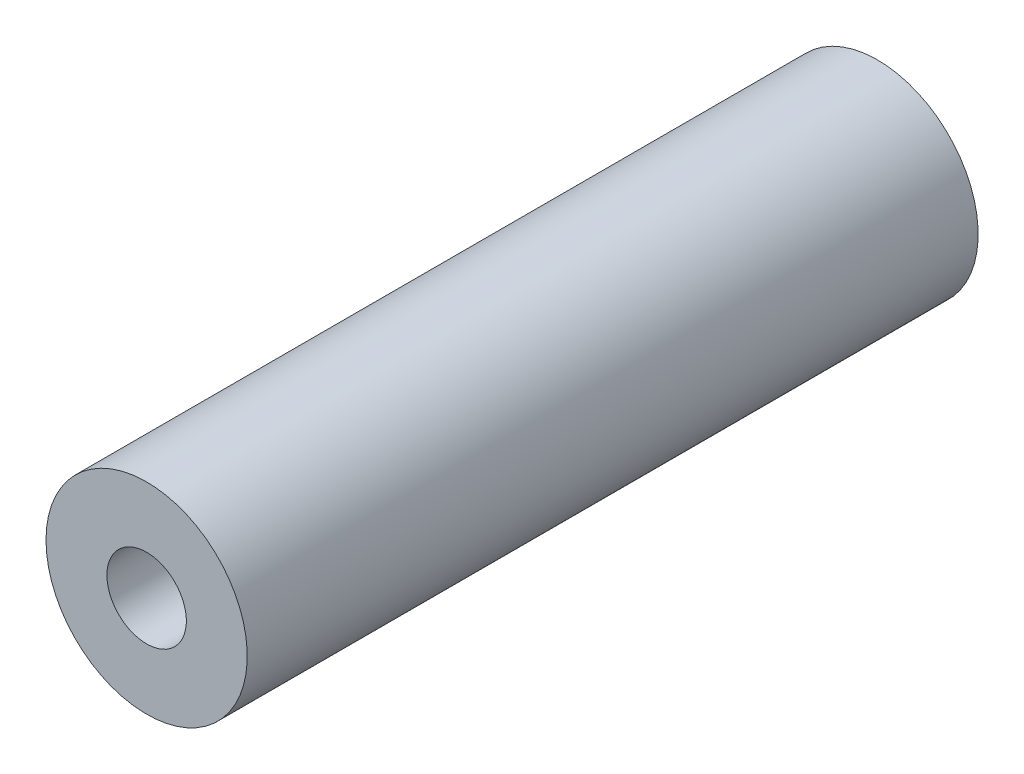
ISO-10303-21;
HEADER;
FILE_DESCRIPTION(('STEP AP214'),'2;1');
FILE_NAME('part.step','',(''),(''),'','','');
FILE_SCHEMA(('AUTOMOTIVE_DESIGN { 1 0 10303 214 1 1 1 1 }'));
ENDSEC;
DATA;
#1=APPLICATION_CONTEXT('core data for automotive mechanical design processes');
#2=APPLICATION_PROTOCOL_DEFINITION('international standard','automotive_design',2000,#1);
#3=PRODUCT_CONTEXT('',#1,'mechanical');
#4=PRODUCT('Part','Part','',(#3));
#5=PRODUCT_RELATED_PRODUCT_CATEGORY('part','',(#4));
#6=PRODUCT_DEFINITION_FORMATION('','',#4);
#7=PRODUCT_DEFINITION_CONTEXT('part definition',#1,'design');
#8=PRODUCT_DEFINITION('design','',#6,#7);
#9=PRODUCT_DEFINITION_SHAPE('','',#8);
#10=(LENGTH_UNIT() NAMED_UNIT(*) SI_UNIT(.MILLI.,.METRE.));
#11=(NAMED_UNIT(*) PLANE_ANGLE_UNIT() SI_UNIT($,.RADIAN.));
#12=(NAMED_UNIT(*) SI_UNIT($,.STERADIAN.) SOLID_ANGLE_UNIT());
#13=UNCERTAINTY_MEASURE_WITH_UNIT(LENGTH_MEASURE(1.E-05),#10,'distance_accuracy_value','');
#14=(GEOMETRIC_REPRESENTATION_CONTEXT(3) GLOBAL_UNCERTAINTY_ASSIGNED_CONTEXT((#13)) GLOBAL_UNIT_ASSIGNED_CONTEXT((#10,
#11,#12)) REPRESENTATION_CONTEXT('',''));
#15=CARTESIAN_POINT('',(0.,0.,0.));
#16=DIRECTION('',(0.,0.,1.));
#17=DIRECTION('',(1.,0.,0.));
#18=AXIS2_PLACEMENT_3D('',#15,#16,#17);
#19=CARTESIAN_POINT('',(0.,0.,38.1));
#20=DIRECTION('',(0.,0.,1.));
#21=DIRECTION('',(1.,0.,0.));
#22=AXIS2_PLACEMENT_3D('',#19,#20,#21);
#23=PLANE('',#22);
#24=CARTESIAN_POINT('',(0.,0.,38.1));
#25=DIRECTION('',(0.,0.,1.));
#26=DIRECTION('',(1.,0.,0.));
#27=AXIS2_PLACEMENT_3D('',#24,#25,#26);
#28=CIRCLE('',#27,5.2451);
#29=CARTESIAN_POINT('',(-5.2451,0.,38.1));
#30=VERTEX_POINT('',#29);
#31=EDGE_CURVE('E10',#30,#30,#28,.T.);
#32=ORIENTED_EDGE('',*,*,#31,.T.);
#33=EDGE_LOOP('',(#32));
#34=FACE_BOUND('',#33,.T.);
#35=CARTESIAN_POINT('',(0.,0.,38.1));
#36=DIRECTION('',(0.,0.,1.));
#37=DIRECTION('',(1.,0.,0.));
#38=AXIS2_PLACEMENT_3D('',#35,#36,#37);
#39=CIRCLE('',#38,2.0701);
#40=CARTESIAN_POINT('',(-2.0701,0.,38.1));
#41=VERTEX_POINT('',#40);
#42=EDGE_CURVE('E44',#41,#41,#39,.T.);
#43=ORIENTED_EDGE('',*,*,#42,.F.);
#44=EDGE_LOOP('',(#43));
#45=FACE_BOUND('',#44,.T.);
#46=ADVANCED_FACE('F33',(#34,#45),#23,.T.);
#47=CARTESIAN_POINT('',(0.,0.,0.));
#48=DIRECTION('',(0.,0.,1.));
#49=DIRECTION('',(1.,0.,0.));
#50=AXIS2_PLACEMENT_3D('',#47,#48,#49);
#51=PLANE('',#50);
#52=CARTESIAN_POINT('',(0.,0.,0.));
#53=DIRECTION('',(0.,0.,1.));
#54=DIRECTION('',(1.,0.,0.));
#55=AXIS2_PLACEMENT_3D('',#52,#53,#54);
#56=CIRCLE('',#55,5.2451);
#57=CARTESIAN_POINT('',(-5.2451,0.,0.));
#58=VERTEX_POINT('',#57);
#59=EDGE_CURVE('E37',#58,#58,#56,.T.);
#60=ORIENTED_EDGE('',*,*,#59,.F.);
#61=EDGE_LOOP('',(#60));
#62=FACE_BOUND('',#61,.T.);
#63=CARTESIAN_POINT('',(0.,0.,0.));
#64=DIRECTION('',(0.,0.,1.));
#65=DIRECTION('',(1.,0.,0.));
#66=AXIS2_PLACEMENT_3D('',#63,#64,#65);
#67=CIRCLE('',#66,2.0701);
#68=CARTESIAN_POINT('',(-2.0701,0.,0.));
#69=VERTEX_POINT('',#68);
#70=EDGE_CURVE('E46',#69,#69,#67,.T.);
#71=ORIENTED_EDGE('',*,*,#70,.T.);
#72=EDGE_LOOP('',(#71));
#73=FACE_BOUND('',#72,.T.);
#74=ADVANCED_FACE('F56',(#62,#73),#51,.F.);
#75=CARTESIAN_POINT('',(0.,0.,38.1));
#76=DIRECTION('',(0.,0.,-1.));
#77=DIRECTION('',(-1.,0.,0.));
#78=AXIS2_PLACEMENT_3D('',#75,#76,#77);
#79=CYLINDRICAL_SURFACE('',#78,5.2451);
#80=CARTESIAN_POINT('',(-5.2451,0.,38.1));
#81=CARTESIAN_POINT('',(-5.2451,0.,37.703125));
#82=CARTESIAN_POINT('',(-5.2451,0.,37.30625));
#83=CARTESIAN_POINT('',(-5.2451,0.,36.5125));
#84=CARTESIAN_POINT('',(-5.2451,0.,36.115625));
#85=CARTESIAN_POINT('',(-5.2451,0.,35.321875));
#86=CARTESIAN_POINT('',(-5.2451,0.,34.925));
#87=CARTESIAN_POINT('',(-5.2451,0.,34.13125));
#88=CARTESIAN_POINT('',(-5.2451,0.,33.734375));
#89=CARTESIAN_POINT('',(-5.2451,0.,32.940625));
#90=CARTESIAN_POINT('',(-5.2451,0.,32.54375));
#91=CARTESIAN_POINT('',(-5.2451,0.,31.75));
#92=CARTESIAN_POINT('',(-5.2451,0.,31.353125));
#93=CARTESIAN_POINT('',(-5.2451,0.,30.559375));
#94=CARTESIAN_POINT('',(-5.2451,0.,30.1625));
#95=CARTESIAN_POINT('',(-5.2451,0.,29.36875));
#96=CARTESIAN_POINT('',(-5.2451,0.,28.971875));
#97=CARTESIAN_POINT('',(-5.2451,0.,28.178125));
#98=CARTESIAN_POINT('',(-5.2451,0.,27.78125));
#99=CARTESIAN_POINT('',(-5.2451,0.,26.9875));
#100=CARTESIAN_POINT('',(-5.2451,0.,26.590625));
#101=CARTESIAN_POINT('',(-5.2451,0.,25.796875));
#102=CARTESIAN_POINT('',(-5.2451,0.,25.4));
#103=CARTESIAN_POINT('',(-5.2451,0.,24.60625));
#104=CARTESIAN_POINT('',(-5.2451,0.,24.209375));
#105=CARTESIAN_POINT('',(-5.2451,0.,23.415625));
#106=CARTESIAN_POINT('',(-5.2451,0.,23.01875));
#107=CARTESIAN_POINT('',(-5.2451,0.,22.225));
#108=CARTESIAN_POINT('',(-5.2451,0.,21.828125));
#109=CARTESIAN_POINT('',(-5.2451,0.,21.034375));
#110=CARTESIAN_POINT('',(-5.2451,0.,20.6375));
#111=CARTESIAN_POINT('',(-5.2451,0.,19.84375));
#112=CARTESIAN_POINT('',(-5.2451,0.,19.446875));
#113=CARTESIAN_POINT('',(-5.2451,0.,18.653125));
#114=CARTESIAN_POINT('',(-5.2451,0.,18.25625));
#115=CARTESIAN_POINT('',(-5.2451,0.,17.4625));
#116=CARTESIAN_POINT('',(-5.2451,0.,17.065625));
#117=CARTESIAN_POINT('',(-5.2451,0.,16.271875));
#118=CARTESIAN_POINT('',(-5.2451,0.,15.875));
#119=CARTESIAN_POINT('',(-5.2451,0.,15.08125));
#120=CARTESIAN_POINT('',(-5.2451,0.,14.684375));
#121=CARTESIAN_POINT('',(-5.2451,0.,13.890625));
#122=CARTESIAN_POINT('',(-5.2451,0.,13.49375));
#123=CARTESIAN_POINT('',(-5.2451,0.,12.7));
#124=CARTESIAN_POINT('',(-5.2451,0.,12.303125));
#125=CARTESIAN_POINT('',(-5.2451,0.,11.509375));
#126=CARTESIAN_POINT('',(-5.2451,0.,11.1125));
#127=CARTESIAN_POINT('',(-5.2451,0.,10.31875));
#128=CARTESIAN_POINT('',(-5.2451,0.,9.92187499999999));
#129=CARTESIAN_POINT('',(-5.2451,0.,9.128125));
#130=CARTESIAN_POINT('',(-5.2451,0.,8.73124999999999));
#131=CARTESIAN_POINT('',(-5.2451,0.,7.93749999999999));
#132=CARTESIAN_POINT('',(-5.2451,0.,7.54062499999999));
#133=CARTESIAN_POINT('',(-5.2451,0.,6.746875));
#134=CARTESIAN_POINT('',(-5.2451,0.,6.35));
#135=CARTESIAN_POINT('',(-5.2451,0.,5.55625));
#136=CARTESIAN_POINT('',(-5.2451,0.,5.159375));
#137=CARTESIAN_POINT('',(-5.2451,0.,4.365625));
#138=CARTESIAN_POINT('',(-5.2451,0.,3.96875));
#139=CARTESIAN_POINT('',(-5.2451,0.,3.175));
#140=CARTESIAN_POINT('',(-5.2451,0.,2.778125));
#141=CARTESIAN_POINT('',(-5.2451,0.,1.984375));
#142=CARTESIAN_POINT('',(-5.2451,0.,1.5875));
#143=CARTESIAN_POINT('',(-5.2451,0.,0.79375));
#144=CARTESIAN_POINT('',(-5.2451,0.,0.396875));
#145=CARTESIAN_POINT('',(-5.2451,0.,0.));
#146=B_SPLINE_CURVE_WITH_KNOTS('',3,(#80,#81,#82,#83,#84,#85,#86,#87,#88,#89,#90,#91,#92,#93,
#94,#95,#96,#97,#98,#99,#100,#101,#102,#103,#104,#105,#106,#107,#108,#109,#110,#111,#112,#113,
#114,#115,#116,#117,#118,#119,#120,#121,#122,#123,#124,#125,#126,#127,#128,#129,#130,#131,#132,
#133,#134,#135,#136,#137,#138,#139,#140,#141,#142,#143,#144,#145),.UNSPECIFIED.,.F.,.F.,(4,2,2,
2,2,2,2,2,2,2,2,2,2,2,2,2,2,2,2,2,2,2,2,2,2,2,2,2,2,2,2,2,4),(0.,1.190625,2.38125,3.571875,
4.7625,5.953125,7.14375,8.334375,9.52500000000001,10.715625,11.90625,13.096875,14.2875,
15.478125,16.66875,17.859375,19.05,20.240625,21.43125,22.621875,23.8125,25.003125,26.19375,
27.384375,28.575,29.765625,30.95625,32.146875,33.3375,34.528125,35.71875,36.909375,38.1),.UNSPECIFIED.);
#147=EDGE_CURVE('BSEAM35',#30,#58,#146,.T.);
#148=ORIENTED_EDGE('',*,*,#31,.F.);
#149=ORIENTED_EDGE('',*,*,#59,.T.);
#150=ORIENTED_EDGE('',*,*,#147,.T.);
#151=ORIENTED_EDGE('',*,*,#147,.F.);
#152=EDGE_LOOP('',(#148,#150,#149,#151));
#153=FACE_BOUND('',#152,.T.);
#154=ADVANCED_FACE('F35',(#153),#79,.T.);
#155=CARTESIAN_POINT('',(0.,0.,38.1));
#156=DIRECTION('',(0.,0.,-1.));
#157=DIRECTION('',(-1.,0.,0.));
#158=AXIS2_PLACEMENT_3D('',#155,#156,#157);
#159=CYLINDRICAL_SURFACE('',#158,2.0701);
#160=CARTESIAN_POINT('',(-2.0701,0.,38.1));
#161=CARTESIAN_POINT('',(-2.0701,0.,37.703125));
#162=CARTESIAN_POINT('',(-2.0701,0.,37.30625));
#163=CARTESIAN_POINT('',(-2.0701,0.,36.5125));
#164=CARTESIAN_POINT('',(-2.0701,0.,36.115625));
#165=CARTESIAN_POINT('',(-2.0701,0.,35.321875));
#166=CARTESIAN_POINT('',(-2.0701,0.,34.925));
#167=CARTESIAN_POINT('',(-2.0701,0.,34.13125));
#168=CARTESIAN_POINT('',(-2.0701,0.,33.734375));
#169=CARTESIAN_POINT('',(-2.0701,0.,32.940625));
#170=CARTESIAN_POINT('',(-2.0701,0.,32.54375));
#171=CARTESIAN_POINT('',(-2.0701,0.,31.75));
#172=CARTESIAN_POINT('',(-2.0701,0.,31.353125));
#173=CARTESIAN_POINT('',(-2.0701,0.,30.559375));
#174=CARTESIAN_POINT('',(-2.0701,0.,30.1625));
#175=CARTESIAN_POINT('',(-2.0701,0.,29.36875));
#176=CARTESIAN_POINT('',(-2.0701,0.,28.971875));
#177=CARTESIAN_POINT('',(-2.0701,0.,28.178125));
#178=CARTESIAN_POINT('',(-2.0701,0.,27.78125));
#179=CARTESIAN_POINT('',(-2.0701,0.,26.9875));
#180=CARTESIAN_POINT('',(-2.0701,0.,26.590625));
#181=CARTESIAN_POINT('',(-2.0701,0.,25.796875));
#182=CARTESIAN_POINT('',(-2.0701,0.,25.4));
#183=CARTESIAN_POINT('',(-2.0701,0.,24.60625));
#184=CARTESIAN_POINT('',(-2.0701,0.,24.209375));
#185=CARTESIAN_POINT('',(-2.0701,0.,23.415625));
#186=CARTESIAN_POINT('',(-2.0701,0.,23.01875));
#187=CARTESIAN_POINT('',(-2.0701,0.,22.225));
#188=CARTESIAN_POINT('',(-2.0701,0.,21.828125));
#189=CARTESIAN_POINT('',(-2.0701,0.,21.034375));
#190=CARTESIAN_POINT('',(-2.0701,0.,20.6375));
#191=CARTESIAN_POINT('',(-2.0701,0.,19.84375));
#192=CARTESIAN_POINT('',(-2.0701,0.,19.446875));
#193=CARTESIAN_POINT('',(-2.0701,0.,18.653125));
#194=CARTESIAN_POINT('',(-2.0701,0.,18.25625));
#195=CARTESIAN_POINT('',(-2.0701,0.,17.4625));
#196=CARTESIAN_POINT('',(-2.0701,0.,17.065625));
#197=CARTESIAN_POINT('',(-2.0701,0.,16.271875));
#198=CARTESIAN_POINT('',(-2.0701,0.,15.875));
#199=CARTESIAN_POINT('',(-2.0701,0.,15.08125));
#200=CARTESIAN_POINT('',(-2.0701,0.,14.684375));
#201=CARTESIAN_POINT('',(-2.0701,0.,13.890625));
#202=CARTESIAN_POINT('',(-2.0701,0.,13.49375));
#203=CARTESIAN_POINT('',(-2.0701,0.,12.7));
#204=CARTESIAN_POINT('',(-2.0701,0.,12.303125));
#205=CARTESIAN_POINT('',(-2.0701,0.,11.509375));
#206=CARTESIAN_POINT('',(-2.0701,0.,11.1125));
#207=CARTESIAN_POINT('',(-2.0701,0.,10.31875));
#208=CARTESIAN_POINT('',(-2.0701,0.,9.921875));
#209=CARTESIAN_POINT('',(-2.0701,0.,9.128125));
#210=CARTESIAN_POINT('',(-2.0701,0.,8.73125));
#211=CARTESIAN_POINT('',(-2.0701,0.,7.9375));
#212=CARTESIAN_POINT('',(-2.0701,0.,7.540625));
#213=CARTESIAN_POINT('',(-2.0701,0.,6.746875));
#214=CARTESIAN_POINT('',(-2.0701,0.,6.35));
#215=CARTESIAN_POINT('',(-2.0701,0.,5.55625));
#216=CARTESIAN_POINT('',(-2.0701,0.,5.159375));
#217=CARTESIAN_POINT('',(-2.0701,0.,4.365625));
#218=CARTESIAN_POINT('',(-2.0701,0.,3.96875));
#219=CARTESIAN_POINT('',(-2.0701,0.,3.175));
#220=CARTESIAN_POINT('',(-2.0701,0.,2.778125));
#221=CARTESIAN_POINT('',(-2.0701,0.,1.984375));
#222=CARTESIAN_POINT('',(-2.0701,0.,1.5875));
#223=CARTESIAN_POINT('',(-2.0701,0.,0.79375));
#224=CARTESIAN_POINT('',(-2.0701,0.,0.396875));
#225=CARTESIAN_POINT('',(-2.0701,0.,0.));
#226=B_SPLINE_CURVE_WITH_KNOTS('',3,(#160,#161,#162,#163,#164,#165,#166,#167,#168,#169,#170,
#171,#172,#173,#174,#175,#176,#177,#178,#179,#180,#181,#182,#183,#184,#185,#186,#187,#188,#189,
#190,#191,#192,#193,#194,#195,#196,#197,#198,#199,#200,#201,#202,#203,#204,#205,#206,#207,#208,
#209,#210,#211,#212,#213,#214,#215,#216,#217,#218,#219,#220,#221,#222,#223,#224,#225),
.UNSPECIFIED.,.F.,.F.,(4,2,2,2,2,2,2,2,2,2,2,2,2,2,2,2,2,2,2,2,2,2,2,2,2,2,2,2,2,2,2,2,4),(0.,
1.19062499999999,2.38124999999999,3.571875,4.7625,5.953125,7.14375,8.33437499999999,9.525,
10.715625,11.90625,13.096875,14.2875,15.478125,16.66875,17.859375,19.05,20.240625,21.43125,
22.621875,23.8125,25.003125,26.19375,27.384375,28.575,29.765625,30.95625,32.146875,33.3375,
34.528125,35.71875,36.909375,38.1),.UNSPECIFIED.);
#227=EDGE_CURVE('BSEAM52',#41,#69,#226,.T.);
#228=ORIENTED_EDGE('',*,*,#42,.T.);
#229=ORIENTED_EDGE('',*,*,#70,.F.);
#230=ORIENTED_EDGE('',*,*,#227,.T.);
#231=ORIENTED_EDGE('',*,*,#227,.F.);
#232=EDGE_LOOP('',(#228,#230,#229,#231));
#233=FACE_BOUND('',#232,.T.);
#234=ADVANCED_FACE('F52',(#233),#159,.F.);
#235=CLOSED_SHELL('',(#46,#74,#154,#234));
#236=MANIFOLD_SOLID_BREP('B2',#235);
#237=ADVANCED_BREP_SHAPE_REPRESENTATION('',(#18,#236),#14);
#238=SHAPE_DEFINITION_REPRESENTATION(#9,#237);
ENDSEC;
END-ISO-10303-21;
